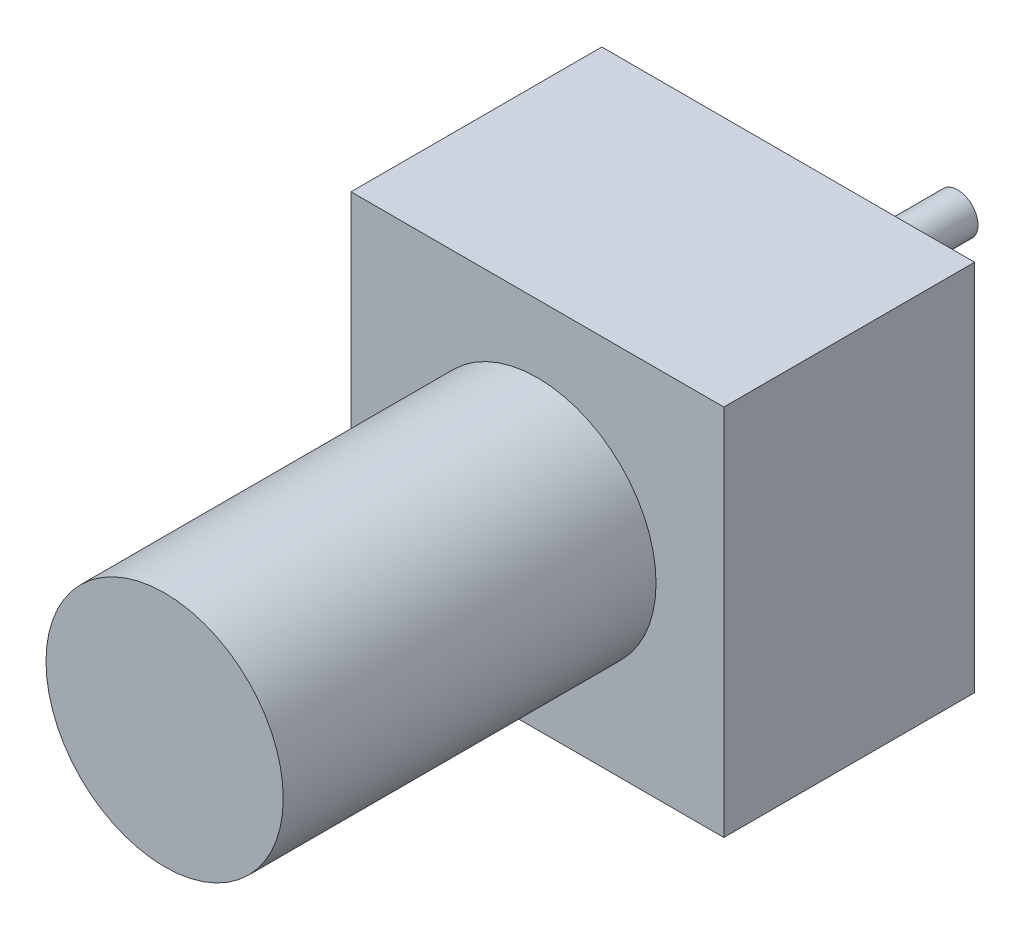
ISO-10303-21;
HEADER;
FILE_DESCRIPTION(('STEP AP214'),'2;1');
FILE_NAME('part.step','',(''),(''),'','','');
FILE_SCHEMA(('AUTOMOTIVE_DESIGN { 1 0 10303 214 1 1 1 1 }'));
ENDSEC;
DATA;
#1=APPLICATION_CONTEXT('core data for automotive mechanical design processes');
#2=APPLICATION_PROTOCOL_DEFINITION('international standard','automotive_design',2000,#1);
#3=PRODUCT_CONTEXT('',#1,'mechanical');
#4=PRODUCT('Part','Part','',(#3));
#5=PRODUCT_RELATED_PRODUCT_CATEGORY('part','',(#4));
#6=PRODUCT_DEFINITION_FORMATION('','',#4);
#7=PRODUCT_DEFINITION_CONTEXT('part definition',#1,'design');
#8=PRODUCT_DEFINITION('design','',#6,#7);
#9=PRODUCT_DEFINITION_SHAPE('','',#8);
#10=(LENGTH_UNIT() NAMED_UNIT(*) SI_UNIT(.MILLI.,.METRE.));
#11=(NAMED_UNIT(*) PLANE_ANGLE_UNIT() SI_UNIT($,.RADIAN.));
#12=(NAMED_UNIT(*) SI_UNIT($,.STERADIAN.) SOLID_ANGLE_UNIT());
#13=UNCERTAINTY_MEASURE_WITH_UNIT(LENGTH_MEASURE(1.E-05),#10,'distance_accuracy_value','');
#14=(GEOMETRIC_REPRESENTATION_CONTEXT(3) GLOBAL_UNCERTAINTY_ASSIGNED_CONTEXT((#13)) GLOBAL_UNIT_ASSIGNED_CONTEXT((#10,
#11,#12)) REPRESENTATION_CONTEXT('',''));
#15=CARTESIAN_POINT('',(0.,0.,0.));
#16=DIRECTION('',(0.,0.,1.));
#17=DIRECTION('',(1.,0.,0.));
#18=AXIS2_PLACEMENT_3D('',#15,#16,#17);
#19=CARTESIAN_POINT('',(27.5,27.5,37.));
#20=DIRECTION('',(-1.,0.,0.));
#21=DIRECTION('',(0.,0.,1.));
#22=AXIS2_PLACEMENT_3D('',#19,#20,#21);
#23=PLANE('',#22);
#24=DIRECTION('',(0.,1.,0.));
#25=VECTOR('',#24,1.);
#26=CARTESIAN_POINT('',(27.5,27.5,0.));
#27=LINE('',#26,#25);
#28=CARTESIAN_POINT('',(27.5,-27.5,0.));
#29=VERTEX_POINT('',#28);
#30=CARTESIAN_POINT('',(27.5,27.5,0.));
#31=VERTEX_POINT('',#30);
#32=EDGE_CURVE('E111',#29,#31,#27,.T.);
#33=ORIENTED_EDGE('',*,*,#32,.T.);
#34=DIRECTION('',(0.,0.,-1.));
#35=VECTOR('',#34,1.);
#36=CARTESIAN_POINT('',(27.5,27.5,37.));
#37=LINE('',#36,#35);
#38=CARTESIAN_POINT('',(27.5,27.5,37.));
#39=VERTEX_POINT('',#38);
#40=EDGE_CURVE('E100',#39,#31,#37,.T.);
#41=ORIENTED_EDGE('',*,*,#40,.F.);
#42=DIRECTION('',(0.,1.,0.));
#43=VECTOR('',#42,1.);
#44=CARTESIAN_POINT('',(27.5,27.5,37.));
#45=LINE('',#44,#43);
#46=CARTESIAN_POINT('',(27.5,-27.5,37.));
#47=VERTEX_POINT('',#46);
#48=EDGE_CURVE('E92',#47,#39,#45,.T.);
#49=ORIENTED_EDGE('',*,*,#48,.F.);
#50=DIRECTION('',(0.,0.,-1.));
#51=VECTOR('',#50,1.);
#52=CARTESIAN_POINT('',(27.5,-27.5,37.));
#53=LINE('',#52,#51);
#54=EDGE_CURVE('E107',#47,#29,#53,.T.);
#55=ORIENTED_EDGE('',*,*,#54,.T.);
#56=EDGE_LOOP('',(#33,#41,#49,#55));
#57=FACE_BOUND('',#56,.T.);
#58=ADVANCED_FACE('F39',(#57),#23,.F.);
#59=CARTESIAN_POINT('',(-27.5,27.5,37.));
#60=DIRECTION('',(0.,-1.,0.));
#61=DIRECTION('',(0.,0.,-1.));
#62=AXIS2_PLACEMENT_3D('',#59,#60,#61);
#63=PLANE('',#62);
#64=DIRECTION('',(-1.,0.,0.));
#65=VECTOR('',#64,1.);
#66=CARTESIAN_POINT('',(-27.5,27.5,0.));
#67=LINE('',#66,#65);
#68=CARTESIAN_POINT('',(-27.5,27.5,0.));
#69=VERTEX_POINT('',#68);
#70=EDGE_CURVE('E98',#31,#69,#67,.T.);
#71=ORIENTED_EDGE('',*,*,#70,.T.);
#72=DIRECTION('',(0.,0.,-1.));
#73=VECTOR('',#72,1.);
#74=CARTESIAN_POINT('',(-27.5,27.5,37.));
#75=LINE('',#74,#73);
#76=CARTESIAN_POINT('',(-27.5,27.5,37.));
#77=VERTEX_POINT('',#76);
#78=EDGE_CURVE('E96',#77,#69,#75,.T.);
#79=ORIENTED_EDGE('',*,*,#78,.F.);
#80=DIRECTION('',(-1.,0.,0.));
#81=VECTOR('',#80,1.);
#82=CARTESIAN_POINT('',(-27.5,27.5,37.));
#83=LINE('',#82,#81);
#84=EDGE_CURVE('E87',#39,#77,#83,.T.);
#85=ORIENTED_EDGE('',*,*,#84,.F.);
#86=ORIENTED_EDGE('',*,*,#40,.T.);
#87=EDGE_LOOP('',(#71,#79,#85,#86));
#88=FACE_BOUND('',#87,.T.);
#89=ADVANCED_FACE('F97',(#88),#63,.F.);
#90=CARTESIAN_POINT('',(-27.5,27.5,37.));
#91=DIRECTION('',(1.,0.,0.));
#92=DIRECTION('',(0.,0.,-1.));
#93=AXIS2_PLACEMENT_3D('',#90,#91,#92);
#94=PLANE('',#93);
#95=DIRECTION('',(0.,-1.,0.));
#96=VECTOR('',#95,1.);
#97=CARTESIAN_POINT('',(-27.5,27.5,0.));
#98=LINE('',#97,#96);
#99=CARTESIAN_POINT('',(-27.5,-27.5,0.));
#100=VERTEX_POINT('',#99);
#101=EDGE_CURVE('E73',#69,#100,#98,.T.);
#102=ORIENTED_EDGE('',*,*,#101,.T.);
#103=DIRECTION('',(0.,0.,-1.));
#104=VECTOR('',#103,1.);
#105=CARTESIAN_POINT('',(-27.5,-27.5,37.));
#106=LINE('',#105,#104);
#107=CARTESIAN_POINT('',(-27.5,-27.5,37.));
#108=VERTEX_POINT('',#107);
#109=EDGE_CURVE('E101',#108,#100,#106,.T.);
#110=ORIENTED_EDGE('',*,*,#109,.F.);
#111=DIRECTION('',(0.,-1.,0.));
#112=VECTOR('',#111,1.);
#113=CARTESIAN_POINT('',(-27.5,27.5,37.));
#114=LINE('',#113,#112);
#115=EDGE_CURVE('E90',#77,#108,#114,.T.);
#116=ORIENTED_EDGE('',*,*,#115,.F.);
#117=ORIENTED_EDGE('',*,*,#78,.T.);
#118=EDGE_LOOP('',(#102,#110,#116,#117));
#119=FACE_BOUND('',#118,.T.);
#120=ADVANCED_FACE('F103',(#119),#94,.F.);
#121=CARTESIAN_POINT('',(-27.5,-27.5,37.));
#122=DIRECTION('',(0.,1.,0.));
#123=DIRECTION('',(0.,0.,1.));
#124=AXIS2_PLACEMENT_3D('',#121,#122,#123);
#125=PLANE('',#124);
#126=DIRECTION('',(1.,0.,0.));
#127=VECTOR('',#126,1.);
#128=CARTESIAN_POINT('',(-27.5,-27.5,0.));
#129=LINE('',#128,#127);
#130=EDGE_CURVE('E79',#100,#29,#129,.T.);
#131=ORIENTED_EDGE('',*,*,#130,.T.);
#132=ORIENTED_EDGE('',*,*,#54,.F.);
#133=DIRECTION('',(1.,0.,0.));
#134=VECTOR('',#133,1.);
#135=CARTESIAN_POINT('',(-27.5,-27.5,37.));
#136=LINE('',#135,#134);
#137=EDGE_CURVE('E56',#108,#47,#136,.T.);
#138=ORIENTED_EDGE('',*,*,#137,.F.);
#139=ORIENTED_EDGE('',*,*,#109,.T.);
#140=EDGE_LOOP('',(#131,#132,#138,#139));
#141=FACE_BOUND('',#140,.T.);
#142=ADVANCED_FACE('F157',(#141),#125,.F.);
#143=CARTESIAN_POINT('',(0.,0.,37.));
#144=DIRECTION('',(0.,0.,1.));
#145=DIRECTION('',(1.,0.,0.));
#146=AXIS2_PLACEMENT_3D('',#143,#144,#145);
#147=PLANE('',#146);
#148=CARTESIAN_POINT('',(0.,0.,37.));
#149=DIRECTION('',(0.,0.,1.));
#150=DIRECTION('',(1.,0.,0.));
#151=AXIS2_PLACEMENT_3D('',#148,#149,#150);
#152=CIRCLE('',#151,17.5);
#153=CARTESIAN_POINT('',(17.5,0.,37.));
#154=VERTEX_POINT('',#153);
#155=EDGE_CURVE('E48',#154,#154,#152,.T.);
#156=ORIENTED_EDGE('',*,*,#155,.F.);
#157=EDGE_LOOP('',(#156));
#158=FACE_BOUND('',#157,.T.);
#159=ORIENTED_EDGE('',*,*,#48,.T.);
#160=ORIENTED_EDGE('',*,*,#84,.T.);
#161=ORIENTED_EDGE('',*,*,#115,.T.);
#162=ORIENTED_EDGE('',*,*,#137,.T.);
#163=EDGE_LOOP('',(#159,#160,#161,#162));
#164=FACE_BOUND('',#163,.T.);
#165=ADVANCED_FACE('F88',(#158,#164),#147,.T.);
#166=CARTESIAN_POINT('',(0.,0.,0.));
#167=DIRECTION('',(0.,0.,1.));
#168=DIRECTION('',(1.,0.,0.));
#169=AXIS2_PLACEMENT_3D('',#166,#167,#168);
#170=PLANE('',#169);
#171=CARTESIAN_POINT('',(0.,7.5,0.));
#172=DIRECTION('',(0.,0.,1.));
#173=DIRECTION('',(1.,0.,0.));
#174=AXIS2_PLACEMENT_3D('',#171,#172,#173);
#175=CIRCLE('',#174,3.);
#176=CARTESIAN_POINT('',(3.,7.5,0.));
#177=VERTEX_POINT('',#176);
#178=EDGE_CURVE('E11',#177,#177,#175,.F.);
#179=ORIENTED_EDGE('',*,*,#178,.F.);
#180=EDGE_LOOP('',(#179));
#181=FACE_BOUND('',#180,.T.);
#182=ORIENTED_EDGE('',*,*,#32,.F.);
#183=ORIENTED_EDGE('',*,*,#130,.F.);
#184=ORIENTED_EDGE('',*,*,#101,.F.);
#185=ORIENTED_EDGE('',*,*,#70,.F.);
#186=EDGE_LOOP('',(#182,#183,#184,#185));
#187=FACE_BOUND('',#186,.T.);
#188=ADVANCED_FACE('F150',(#181,#187),#170,.F.);
#189=CARTESIAN_POINT('',(0.,0.,92.));
#190=DIRECTION('',(0.,0.,-1.));
#191=DIRECTION('',(-1.,0.,0.));
#192=AXIS2_PLACEMENT_3D('',#189,#190,#191);
#193=CYLINDRICAL_SURFACE('',#192,17.5);
#194=CARTESIAN_POINT('',(0.,0.,92.));
#195=DIRECTION('',(0.,0.,1.));
#196=DIRECTION('',(1.,0.,0.));
#197=AXIS2_PLACEMENT_3D('',#194,#195,#196);
#198=CIRCLE('',#197,17.5);
#199=CARTESIAN_POINT('',(17.5,0.,92.));
#200=VERTEX_POINT('',#199);
#201=EDGE_CURVE('E115',#200,#200,#198,.T.);
#202=ORIENTED_EDGE('',*,*,#201,.F.);
#203=EDGE_LOOP('',(#202));
#204=FACE_BOUND('',#203,.T.);
#205=ORIENTED_EDGE('',*,*,#155,.T.);
#206=EDGE_LOOP('',(#205));
#207=FACE_BOUND('',#206,.T.);
#208=ADVANCED_FACE('F153',(#204,#207),#193,.T.);
#209=CARTESIAN_POINT('',(0.,0.,92.));
#210=DIRECTION('',(0.,0.,1.));
#211=DIRECTION('',(1.,0.,0.));
#212=AXIS2_PLACEMENT_3D('',#209,#210,#211);
#213=PLANE('',#212);
#214=ORIENTED_EDGE('',*,*,#201,.T.);
#215=EDGE_LOOP('',(#214));
#216=FACE_BOUND('',#215,.T.);
#217=ADVANCED_FACE('F146',(#216),#213,.T.);
#218=CARTESIAN_POINT('',(0.,7.5,-25.));
#219=DIRECTION('',(0.,0.,1.));
#220=DIRECTION('',(1.,0.,0.));
#221=AXIS2_PLACEMENT_3D('',#218,#219,#220);
#222=CYLINDRICAL_SURFACE('',#221,3.);
#223=CARTESIAN_POINT('',(0.,7.5,-25.));
#224=DIRECTION('',(0.,0.,-1.));
#225=DIRECTION('',(-1.,0.,0.));
#226=AXIS2_PLACEMENT_3D('',#223,#224,#225);
#227=CIRCLE('',#226,3.);
#228=CARTESIAN_POINT('',(-3.,7.5,-25.));
#229=VERTEX_POINT('',#228);
#230=EDGE_CURVE('E137',#229,#229,#227,.T.);
#231=ORIENTED_EDGE('',*,*,#230,.F.);
#232=EDGE_LOOP('',(#231));
#233=FACE_BOUND('',#232,.T.);
#234=ORIENTED_EDGE('',*,*,#178,.T.);
#235=EDGE_LOOP('',(#234));
#236=FACE_BOUND('',#235,.T.);
#237=ADVANCED_FACE('F143',(#233,#236),#222,.T.);
#238=CARTESIAN_POINT('',(0.,7.5,-25.));
#239=DIRECTION('',(0.,0.,-1.));
#240=DIRECTION('',(-1.,0.,0.));
#241=AXIS2_PLACEMENT_3D('',#238,#239,#240);
#242=PLANE('',#241);
#243=ORIENTED_EDGE('',*,*,#230,.T.);
#244=EDGE_LOOP('',(#243));
#245=FACE_BOUND('',#244,.T.);
#246=ADVANCED_FACE('F141',(#245),#242,.T.);
#247=CLOSED_SHELL('',(#58,#89,#120,#142,#165,#188,#208,#217,#237,#246));
#248=MANIFOLD_SOLID_BREP('B2',#247);
#249=ADVANCED_BREP_SHAPE_REPRESENTATION('',(#18,#248),#14);
#250=SHAPE_DEFINITION_REPRESENTATION(#9,#249);
ENDSEC;
END-ISO-10303-21;
